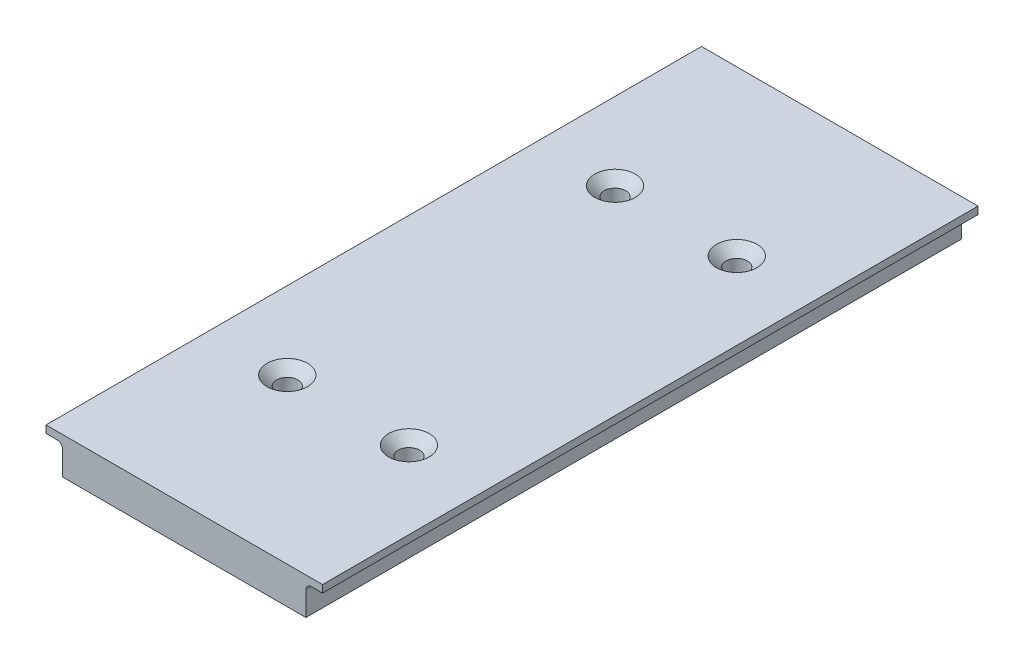
ISO-10303-21;
HEADER;
FILE_DESCRIPTION(('STEP AP214'),'2;1');
FILE_NAME('part.step','',(''),(''),'','','');
FILE_SCHEMA(('AUTOMOTIVE_DESIGN { 1 0 10303 214 1 1 1 1 }'));
ENDSEC;
DATA;
#1=APPLICATION_CONTEXT('core data for automotive mechanical design processes');
#2=APPLICATION_PROTOCOL_DEFINITION('international standard','automotive_design',2000,#1);
#3=PRODUCT_CONTEXT('',#1,'mechanical');
#4=PRODUCT('Part','Part','',(#3));
#5=PRODUCT_RELATED_PRODUCT_CATEGORY('part','',(#4));
#6=PRODUCT_DEFINITION_FORMATION('','',#4);
#7=PRODUCT_DEFINITION_CONTEXT('part definition',#1,'design');
#8=PRODUCT_DEFINITION('design','',#6,#7);
#9=PRODUCT_DEFINITION_SHAPE('','',#8);
#10=(LENGTH_UNIT() NAMED_UNIT(*) SI_UNIT(.MILLI.,.METRE.));
#11=(NAMED_UNIT(*) PLANE_ANGLE_UNIT() SI_UNIT($,.RADIAN.));
#12=(NAMED_UNIT(*) SI_UNIT($,.STERADIAN.) SOLID_ANGLE_UNIT());
#13=UNCERTAINTY_MEASURE_WITH_UNIT(LENGTH_MEASURE(1.E-05),#10,'distance_accuracy_value','');
#14=(GEOMETRIC_REPRESENTATION_CONTEXT(3) GLOBAL_UNCERTAINTY_ASSIGNED_CONTEXT((#13)) GLOBAL_UNIT_ASSIGNED_CONTEXT((#10,
#11,#12)) REPRESENTATION_CONTEXT('',''));
#15=CARTESIAN_POINT('',(0.,0.,0.));
#16=DIRECTION('',(0.,0.,1.));
#17=DIRECTION('',(1.,0.,0.));
#18=AXIS2_PLACEMENT_3D('',#15,#16,#17);
#19=CARTESIAN_POINT('',(-18.75,5.,88.9));
#20=DIRECTION('',(0.,-1.,0.));
#21=DIRECTION('',(0.,0.,-1.));
#22=AXIS2_PLACEMENT_3D('',#19,#20,#21);
#23=PLANE('',#22);
#24=CARTESIAN_POINT('',(8.25063197119054,5.,22.223297507914));
#25=DIRECTION('',(0.,1.,0.));
#26=DIRECTION('',(0.,0.,1.));
#27=AXIS2_PLACEMENT_3D('',#24,#25,#26);
#28=CIRCLE('',#27,2.75);
#29=CARTESIAN_POINT('',(8.25063197119054,5.,24.973297507914));
#30=VERTEX_POINT('',#29);
#31=EDGE_CURVE('E319',#30,#30,#28,.T.);
#32=ORIENTED_EDGE('',*,*,#31,.F.);
#33=EDGE_LOOP('',(#32));
#34=FACE_BOUND('',#33,.T.);
#35=CARTESIAN_POINT('',(-8.25063197119054,5.,22.223297507914));
#36=DIRECTION('',(0.,1.,0.));
#37=DIRECTION('',(0.,0.,1.));
#38=AXIS2_PLACEMENT_3D('',#35,#36,#37);
#39=CIRCLE('',#38,2.75);
#40=CARTESIAN_POINT('',(-8.25063197119054,5.,24.973297507914));
#41=VERTEX_POINT('',#40);
#42=EDGE_CURVE('E307',#41,#41,#39,.T.);
#43=ORIENTED_EDGE('',*,*,#42,.F.);
#44=EDGE_LOOP('',(#43));
#45=FACE_BOUND('',#44,.T.);
#46=CARTESIAN_POINT('',(-8.25063197119054,5.,66.676702492086));
#47=DIRECTION('',(0.,1.,0.));
#48=DIRECTION('',(0.,0.,1.));
#49=AXIS2_PLACEMENT_3D('',#46,#47,#48);
#50=CIRCLE('',#49,2.75);
#51=CARTESIAN_POINT('',(-8.25063197119054,5.,69.426702492086));
#52=VERTEX_POINT('',#51);
#53=EDGE_CURVE('E295',#52,#52,#50,.T.);
#54=ORIENTED_EDGE('',*,*,#53,.F.);
#55=EDGE_LOOP('',(#54));
#56=FACE_BOUND('',#55,.T.);
#57=CARTESIAN_POINT('',(8.25063197119054,5.,66.676702492086));
#58=DIRECTION('',(0.,1.,0.));
#59=DIRECTION('',(0.,0.,1.));
#60=AXIS2_PLACEMENT_3D('',#57,#58,#59);
#61=CIRCLE('',#60,2.75);
#62=CARTESIAN_POINT('',(8.25063197119054,5.,69.426702492086));
#63=VERTEX_POINT('',#62);
#64=EDGE_CURVE('E283',#63,#63,#61,.T.);
#65=ORIENTED_EDGE('',*,*,#64,.F.);
#66=EDGE_LOOP('',(#65));
#67=FACE_BOUND('',#66,.T.);
#68=DIRECTION('',(-1.,0.,0.));
#69=VECTOR('',#68,1.);
#70=CARTESIAN_POINT('',(-18.75,5.,0.));
#71=LINE('',#70,#69);
#72=CARTESIAN_POINT('',(18.75,5.,0.));
#73=VERTEX_POINT('',#72);
#74=CARTESIAN_POINT('',(-18.75,5.,0.));
#75=VERTEX_POINT('',#74);
#76=EDGE_CURVE('E180',#73,#75,#71,.T.);
#77=ORIENTED_EDGE('',*,*,#76,.T.);
#78=DIRECTION('',(0.,0.,-1.));
#79=VECTOR('',#78,1.);
#80=CARTESIAN_POINT('',(-18.75,5.,88.9));
#81=LINE('',#80,#79);
#82=CARTESIAN_POINT('',(-18.75,5.,88.9));
#83=VERTEX_POINT('',#82);
#84=EDGE_CURVE('E11',#83,#75,#81,.T.);
#85=ORIENTED_EDGE('',*,*,#84,.F.);
#86=DIRECTION('',(-1.,0.,0.));
#87=VECTOR('',#86,1.);
#88=CARTESIAN_POINT('',(-18.75,5.,88.9));
#89=LINE('',#88,#87);
#90=CARTESIAN_POINT('',(18.75,5.,88.9));
#91=VERTEX_POINT('',#90);
#92=EDGE_CURVE('E209',#91,#83,#89,.T.);
#93=ORIENTED_EDGE('',*,*,#92,.F.);
#94=DIRECTION('',(0.,0.,-1.));
#95=VECTOR('',#94,1.);
#96=CARTESIAN_POINT('',(18.75,5.,88.9));
#97=LINE('',#96,#95);
#98=EDGE_CURVE('E176',#91,#73,#97,.T.);
#99=ORIENTED_EDGE('',*,*,#98,.T.);
#100=EDGE_LOOP('',(#77,#85,#93,#99));
#101=FACE_BOUND('',#100,.T.);
#102=ADVANCED_FACE('F40',(#34,#45,#56,#67,#101),#23,.F.);
#103=CARTESIAN_POINT('',(-18.75,4.,88.9));
#104=DIRECTION('',(1.,0.,0.));
#105=DIRECTION('',(0.,0.,-1.));
#106=AXIS2_PLACEMENT_3D('',#103,#104,#105);
#107=PLANE('',#106);
#108=DIRECTION('',(0.,-1.,0.));
#109=VECTOR('',#108,1.);
#110=CARTESIAN_POINT('',(-18.75,4.,0.));
#111=LINE('',#110,#109);
#112=CARTESIAN_POINT('',(-18.75,4.,0.));
#113=VERTEX_POINT('',#112);
#114=EDGE_CURVE('E184',#75,#113,#111,.T.);
#115=ORIENTED_EDGE('',*,*,#114,.T.);
#116=DIRECTION('',(0.,0.,-1.));
#117=VECTOR('',#116,1.);
#118=CARTESIAN_POINT('',(-18.75,4.,88.9));
#119=LINE('',#118,#117);
#120=CARTESIAN_POINT('',(-18.75,4.,88.9));
#121=VERTEX_POINT('',#120);
#122=EDGE_CURVE('E49',#121,#113,#119,.T.);
#123=ORIENTED_EDGE('',*,*,#122,.F.);
#124=DIRECTION('',(0.,-1.,0.));
#125=VECTOR('',#124,1.);
#126=CARTESIAN_POINT('',(-18.75,4.,88.9));
#127=LINE('',#126,#125);
#128=EDGE_CURVE('E125',#83,#121,#127,.T.);
#129=ORIENTED_EDGE('',*,*,#128,.F.);
#130=ORIENTED_EDGE('',*,*,#84,.T.);
#131=EDGE_LOOP('',(#115,#123,#129,#130));
#132=FACE_BOUND('',#131,.T.);
#133=ADVANCED_FACE('F328',(#132),#107,.F.);
#134=CARTESIAN_POINT('',(-18.75,4.,88.9));
#135=DIRECTION('',(0.,1.,0.));
#136=DIRECTION('',(0.,0.,1.));
#137=AXIS2_PLACEMENT_3D('',#134,#135,#136);
#138=PLANE('',#137);
#139=DIRECTION('',(1.,0.,0.));
#140=VECTOR('',#139,1.);
#141=CARTESIAN_POINT('',(-18.75,4.,0.));
#142=LINE('',#141,#140);
#143=CARTESIAN_POINT('',(-17.25,4.,0.));
#144=VERTEX_POINT('',#143);
#145=EDGE_CURVE('E188',#113,#144,#142,.T.);
#146=ORIENTED_EDGE('',*,*,#145,.T.);
#147=DIRECTION('',(0.,0.,-1.));
#148=VECTOR('',#147,1.);
#149=CARTESIAN_POINT('',(-17.25,4.,88.9));
#150=LINE('',#149,#148);
#151=CARTESIAN_POINT('',(-17.25,4.,88.9));
#152=VERTEX_POINT('',#151);
#153=EDGE_CURVE('E228',#152,#144,#150,.T.);
#154=ORIENTED_EDGE('',*,*,#153,.F.);
#155=DIRECTION('',(1.,0.,0.));
#156=VECTOR('',#155,1.);
#157=CARTESIAN_POINT('',(-18.75,4.,88.9));
#158=LINE('',#157,#156);
#159=EDGE_CURVE('E239',#121,#152,#158,.T.);
#160=ORIENTED_EDGE('',*,*,#159,.F.);
#161=ORIENTED_EDGE('',*,*,#122,.T.);
#162=EDGE_LOOP('',(#146,#154,#160,#161));
#163=FACE_BOUND('',#162,.T.);
#164=ADVANCED_FACE('F237',(#163),#138,.F.);
#165=CARTESIAN_POINT('',(-17.25,3.25,88.9));
#166=DIRECTION('',(0.,0.,-1.));
#167=DIRECTION('',(-1.,0.,0.));
#168=AXIS2_PLACEMENT_3D('',#165,#166,#167);
#169=CYLINDRICAL_SURFACE('',#168,0.750000000000001);
#170=CARTESIAN_POINT('',(-17.25,3.25,0.));
#171=DIRECTION('',(0.,0.,-1.));
#172=DIRECTION('',(-1.,0.,0.));
#173=AXIS2_PLACEMENT_3D('',#170,#171,#172);
#174=CIRCLE('',#173,0.750000000000001);
#175=CARTESIAN_POINT('',(-16.5,3.25,0.));
#176=VERTEX_POINT('',#175);
#177=EDGE_CURVE('E191',#144,#176,#174,.T.);
#178=ORIENTED_EDGE('',*,*,#177,.T.);
#179=DIRECTION('',(0.,0.,-1.));
#180=VECTOR('',#179,1.);
#181=CARTESIAN_POINT('',(-16.5,3.25,88.9));
#182=LINE('',#181,#180);
#183=CARTESIAN_POINT('',(-16.5,3.25,88.9));
#184=VERTEX_POINT('',#183);
#185=EDGE_CURVE('E224',#184,#176,#182,.T.);
#186=ORIENTED_EDGE('',*,*,#185,.F.);
#187=CARTESIAN_POINT('',(-17.25,3.25,88.9));
#188=DIRECTION('',(0.,0.,-1.));
#189=DIRECTION('',(-1.,0.,0.));
#190=AXIS2_PLACEMENT_3D('',#187,#188,#189);
#191=CIRCLE('',#190,0.750000000000001);
#192=EDGE_CURVE('E258',#152,#184,#191,.T.);
#193=ORIENTED_EDGE('',*,*,#192,.F.);
#194=ORIENTED_EDGE('',*,*,#153,.T.);
#195=EDGE_LOOP('',(#178,#186,#193,#194));
#196=FACE_BOUND('',#195,.T.);
#197=ADVANCED_FACE('F248',(#196),#169,.F.);
#198=CARTESIAN_POINT('',(-16.5,3.25,88.9));
#199=DIRECTION('',(1.,0.,0.));
#200=DIRECTION('',(0.,0.,-1.));
#201=AXIS2_PLACEMENT_3D('',#198,#199,#200);
#202=PLANE('',#201);
#203=DIRECTION('',(0.,-1.,0.));
#204=VECTOR('',#203,1.);
#205=CARTESIAN_POINT('',(-16.5,3.25,0.));
#206=LINE('',#205,#204);
#207=CARTESIAN_POINT('',(-16.5,0.,0.));
#208=VERTEX_POINT('',#207);
#209=EDGE_CURVE('E194',#176,#208,#206,.T.);
#210=ORIENTED_EDGE('',*,*,#209,.T.);
#211=DIRECTION('',(0.,0.,-1.));
#212=VECTOR('',#211,1.);
#213=CARTESIAN_POINT('',(-16.5,0.,88.9));
#214=LINE('',#213,#212);
#215=CARTESIAN_POINT('',(-16.5,0.,88.9));
#216=VERTEX_POINT('',#215);
#217=EDGE_CURVE('E220',#216,#208,#214,.T.);
#218=ORIENTED_EDGE('',*,*,#217,.F.);
#219=DIRECTION('',(0.,-1.,0.));
#220=VECTOR('',#219,1.);
#221=CARTESIAN_POINT('',(-16.5,3.25,88.9));
#222=LINE('',#221,#220);
#223=EDGE_CURVE('E254',#184,#216,#222,.T.);
#224=ORIENTED_EDGE('',*,*,#223,.F.);
#225=ORIENTED_EDGE('',*,*,#185,.T.);
#226=EDGE_LOOP('',(#210,#218,#224,#225));
#227=FACE_BOUND('',#226,.T.);
#228=ADVANCED_FACE('F252',(#227),#202,.F.);
#229=CARTESIAN_POINT('',(-16.5,0.,88.9));
#230=DIRECTION('',(0.,1.,0.));
#231=DIRECTION('',(0.,0.,1.));
#232=AXIS2_PLACEMENT_3D('',#229,#230,#231);
#233=PLANE('',#232);
#234=CARTESIAN_POINT('',(8.25063197119054,0.,22.223297507914));
#235=DIRECTION('',(0.,1.,0.));
#236=DIRECTION('',(0.,0.,1.));
#237=AXIS2_PLACEMENT_3D('',#234,#235,#236);
#238=CIRCLE('',#237,1.44999999999999);
#239=CARTESIAN_POINT('',(8.25063197119054,0.,23.673297507914));
#240=VERTEX_POINT('',#239);
#241=EDGE_CURVE('E311',#240,#240,#238,.T.);
#242=ORIENTED_EDGE('',*,*,#241,.T.);
#243=EDGE_LOOP('',(#242));
#244=FACE_BOUND('',#243,.T.);
#245=CARTESIAN_POINT('',(-8.25063197119054,0.,22.223297507914));
#246=DIRECTION('',(0.,1.,0.));
#247=DIRECTION('',(0.,0.,1.));
#248=AXIS2_PLACEMENT_3D('',#245,#246,#247);
#249=CIRCLE('',#248,1.44999999999999);
#250=CARTESIAN_POINT('',(-8.25063197119054,0.,23.673297507914));
#251=VERTEX_POINT('',#250);
#252=EDGE_CURVE('E299',#251,#251,#249,.T.);
#253=ORIENTED_EDGE('',*,*,#252,.T.);
#254=EDGE_LOOP('',(#253));
#255=FACE_BOUND('',#254,.T.);
#256=CARTESIAN_POINT('',(-8.25063197119054,0.,66.676702492086));
#257=DIRECTION('',(0.,1.,0.));
#258=DIRECTION('',(0.,0.,1.));
#259=AXIS2_PLACEMENT_3D('',#256,#257,#258);
#260=CIRCLE('',#259,1.44999999999999);
#261=CARTESIAN_POINT('',(-8.25063197119054,0.,68.126702492086));
#262=VERTEX_POINT('',#261);
#263=EDGE_CURVE('E287',#262,#262,#260,.T.);
#264=ORIENTED_EDGE('',*,*,#263,.T.);
#265=EDGE_LOOP('',(#264));
#266=FACE_BOUND('',#265,.T.);
#267=CARTESIAN_POINT('',(8.25063197119054,0.,66.676702492086));
#268=DIRECTION('',(0.,1.,0.));
#269=DIRECTION('',(0.,0.,1.));
#270=AXIS2_PLACEMENT_3D('',#267,#268,#269);
#271=CIRCLE('',#270,1.44999999999999);
#272=CARTESIAN_POINT('',(8.25063197119054,0.,68.126702492086));
#273=VERTEX_POINT('',#272);
#274=EDGE_CURVE('E185',#273,#273,#271,.T.);
#275=ORIENTED_EDGE('',*,*,#274,.T.);
#276=EDGE_LOOP('',(#275));
#277=FACE_BOUND('',#276,.T.);
#278=DIRECTION('',(1.,0.,0.));
#279=VECTOR('',#278,1.);
#280=CARTESIAN_POINT('',(-16.5,0.,0.));
#281=LINE('',#280,#279);
#282=CARTESIAN_POINT('',(16.5,0.,0.));
#283=VERTEX_POINT('',#282);
#284=EDGE_CURVE('E197',#208,#283,#281,.T.);
#285=ORIENTED_EDGE('',*,*,#284,.T.);
#286=DIRECTION('',(0.,0.,-1.));
#287=VECTOR('',#286,1.);
#288=CARTESIAN_POINT('',(16.5,0.,88.9));
#289=LINE('',#288,#287);
#290=CARTESIAN_POINT('',(16.5,0.,88.9));
#291=VERTEX_POINT('',#290);
#292=EDGE_CURVE('E216',#291,#283,#289,.T.);
#293=ORIENTED_EDGE('',*,*,#292,.F.);
#294=DIRECTION('',(1.,0.,0.));
#295=VECTOR('',#294,1.);
#296=CARTESIAN_POINT('',(-16.5,0.,88.9));
#297=LINE('',#296,#295);
#298=EDGE_CURVE('E257',#216,#291,#297,.T.);
#299=ORIENTED_EDGE('',*,*,#298,.F.);
#300=ORIENTED_EDGE('',*,*,#217,.T.);
#301=EDGE_LOOP('',(#285,#293,#299,#300));
#302=FACE_BOUND('',#301,.T.);
#303=ADVANCED_FACE('F342',(#244,#255,#266,#277,#302),#233,.F.);
#304=CARTESIAN_POINT('',(16.5,3.25,88.9));
#305=DIRECTION('',(-1.,0.,0.));
#306=DIRECTION('',(0.,0.,1.));
#307=AXIS2_PLACEMENT_3D('',#304,#305,#306);
#308=PLANE('',#307);
#309=DIRECTION('',(0.,1.,0.));
#310=VECTOR('',#309,1.);
#311=CARTESIAN_POINT('',(16.5,3.25,0.));
#312=LINE('',#311,#310);
#313=CARTESIAN_POINT('',(16.5,3.25,0.));
#314=VERTEX_POINT('',#313);
#315=EDGE_CURVE('E200',#283,#314,#312,.T.);
#316=ORIENTED_EDGE('',*,*,#315,.T.);
#317=DIRECTION('',(0.,0.,-1.));
#318=VECTOR('',#317,1.);
#319=CARTESIAN_POINT('',(16.5,3.25,88.9));
#320=LINE('',#319,#318);
#321=CARTESIAN_POINT('',(16.5,3.25,88.9));
#322=VERTEX_POINT('',#321);
#323=EDGE_CURVE('E168',#322,#314,#320,.T.);
#324=ORIENTED_EDGE('',*,*,#323,.F.);
#325=DIRECTION('',(0.,1.,0.));
#326=VECTOR('',#325,1.);
#327=CARTESIAN_POINT('',(16.5,3.25,88.9));
#328=LINE('',#327,#326);
#329=EDGE_CURVE('E157',#291,#322,#328,.T.);
#330=ORIENTED_EDGE('',*,*,#329,.F.);
#331=ORIENTED_EDGE('',*,*,#292,.T.);
#332=EDGE_LOOP('',(#316,#324,#330,#331));
#333=FACE_BOUND('',#332,.T.);
#334=ADVANCED_FACE('F339',(#333),#308,.F.);
#335=CARTESIAN_POINT('',(17.25,3.25,88.9));
#336=DIRECTION('',(0.,0.,-1.));
#337=DIRECTION('',(-1.,0.,0.));
#338=AXIS2_PLACEMENT_3D('',#335,#336,#337);
#339=CYLINDRICAL_SURFACE('',#338,0.750000000000001);
#340=CARTESIAN_POINT('',(17.25,3.25,0.));
#341=DIRECTION('',(0.,0.,-1.));
#342=DIRECTION('',(1.,0.,0.));
#343=AXIS2_PLACEMENT_3D('',#340,#341,#342);
#344=CIRCLE('',#343,0.750000000000001);
#345=CARTESIAN_POINT('',(17.25,4.,0.));
#346=VERTEX_POINT('',#345);
#347=EDGE_CURVE('E166',#314,#346,#344,.T.);
#348=ORIENTED_EDGE('',*,*,#347,.T.);
#349=DIRECTION('',(0.,0.,-1.));
#350=VECTOR('',#349,1.);
#351=CARTESIAN_POINT('',(17.25,4.,88.9));
#352=LINE('',#351,#350);
#353=CARTESIAN_POINT('',(17.25,4.,88.9));
#354=VERTEX_POINT('',#353);
#355=EDGE_CURVE('E163',#354,#346,#352,.T.);
#356=ORIENTED_EDGE('',*,*,#355,.F.);
#357=CARTESIAN_POINT('',(17.25,3.25,88.9));
#358=DIRECTION('',(0.,0.,-1.));
#359=DIRECTION('',(1.,0.,0.));
#360=AXIS2_PLACEMENT_3D('',#357,#358,#359);
#361=CIRCLE('',#360,0.750000000000001);
#362=EDGE_CURVE('E151',#322,#354,#361,.T.);
#363=ORIENTED_EDGE('',*,*,#362,.F.);
#364=ORIENTED_EDGE('',*,*,#323,.T.);
#365=EDGE_LOOP('',(#348,#356,#363,#364));
#366=FACE_BOUND('',#365,.T.);
#367=ADVANCED_FACE('F164',(#366),#339,.F.);
#368=CARTESIAN_POINT('',(18.75,4.,88.9));
#369=DIRECTION('',(0.,1.,0.));
#370=DIRECTION('',(0.,0.,1.));
#371=AXIS2_PLACEMENT_3D('',#368,#369,#370);
#372=PLANE('',#371);
#373=DIRECTION('',(1.,0.,0.));
#374=VECTOR('',#373,1.);
#375=CARTESIAN_POINT('',(18.75,4.,0.));
#376=LINE('',#375,#374);
#377=CARTESIAN_POINT('',(18.75,4.,0.));
#378=VERTEX_POINT('',#377);
#379=EDGE_CURVE('E107',#346,#378,#376,.T.);
#380=ORIENTED_EDGE('',*,*,#379,.T.);
#381=DIRECTION('',(0.,0.,-1.));
#382=VECTOR('',#381,1.);
#383=CARTESIAN_POINT('',(18.75,4.,88.9));
#384=LINE('',#383,#382);
#385=CARTESIAN_POINT('',(18.75,4.,88.9));
#386=VERTEX_POINT('',#385);
#387=EDGE_CURVE('E169',#386,#378,#384,.T.);
#388=ORIENTED_EDGE('',*,*,#387,.F.);
#389=DIRECTION('',(1.,0.,0.));
#390=VECTOR('',#389,1.);
#391=CARTESIAN_POINT('',(18.75,4.,88.9));
#392=LINE('',#391,#390);
#393=EDGE_CURVE('E155',#354,#386,#392,.T.);
#394=ORIENTED_EDGE('',*,*,#393,.F.);
#395=ORIENTED_EDGE('',*,*,#355,.T.);
#396=EDGE_LOOP('',(#380,#388,#394,#395));
#397=FACE_BOUND('',#396,.T.);
#398=ADVANCED_FACE('F171',(#397),#372,.F.);
#399=CARTESIAN_POINT('',(18.75,4.,88.9));
#400=DIRECTION('',(-1.,0.,0.));
#401=DIRECTION('',(0.,0.,1.));
#402=AXIS2_PLACEMENT_3D('',#399,#400,#401);
#403=PLANE('',#402);
#404=DIRECTION('',(0.,1.,0.));
#405=VECTOR('',#404,1.);
#406=CARTESIAN_POINT('',(18.75,4.,0.));
#407=LINE('',#406,#405);
#408=EDGE_CURVE('E115',#378,#73,#407,.T.);
#409=ORIENTED_EDGE('',*,*,#408,.T.);
#410=ORIENTED_EDGE('',*,*,#98,.F.);
#411=DIRECTION('',(0.,1.,0.));
#412=VECTOR('',#411,1.);
#413=CARTESIAN_POINT('',(18.75,4.,88.9));
#414=LINE('',#413,#412);
#415=EDGE_CURVE('E61',#386,#91,#414,.T.);
#416=ORIENTED_EDGE('',*,*,#415,.F.);
#417=ORIENTED_EDGE('',*,*,#387,.T.);
#418=EDGE_LOOP('',(#409,#410,#416,#417));
#419=FACE_BOUND('',#418,.T.);
#420=ADVANCED_FACE('F402',(#419),#403,.F.);
#421=CARTESIAN_POINT('',(17.25,3.25,88.9));
#422=DIRECTION('',(0.,0.,1.));
#423=DIRECTION('',(1.,0.,0.));
#424=AXIS2_PLACEMENT_3D('',#421,#422,#423);
#425=PLANE('',#424);
#426=ORIENTED_EDGE('',*,*,#92,.T.);
#427=ORIENTED_EDGE('',*,*,#128,.T.);
#428=ORIENTED_EDGE('',*,*,#159,.T.);
#429=ORIENTED_EDGE('',*,*,#192,.T.);
#430=ORIENTED_EDGE('',*,*,#223,.T.);
#431=ORIENTED_EDGE('',*,*,#298,.T.);
#432=ORIENTED_EDGE('',*,*,#329,.T.);
#433=ORIENTED_EDGE('',*,*,#362,.T.);
#434=ORIENTED_EDGE('',*,*,#393,.T.);
#435=ORIENTED_EDGE('',*,*,#415,.T.);
#436=EDGE_LOOP('',(#426,#427,#428,#429,#430,#431,#432,#433,#434,#435));
#437=FACE_BOUND('',#436,.T.);
#438=ADVANCED_FACE('F153',(#437),#425,.T.);
#439=CARTESIAN_POINT('',(17.25,3.25,0.));
#440=DIRECTION('',(0.,0.,1.));
#441=DIRECTION('',(1.,0.,0.));
#442=AXIS2_PLACEMENT_3D('',#439,#440,#441);
#443=PLANE('',#442);
#444=ORIENTED_EDGE('',*,*,#76,.F.);
#445=ORIENTED_EDGE('',*,*,#408,.F.);
#446=ORIENTED_EDGE('',*,*,#379,.F.);
#447=ORIENTED_EDGE('',*,*,#347,.F.);
#448=ORIENTED_EDGE('',*,*,#315,.F.);
#449=ORIENTED_EDGE('',*,*,#284,.F.);
#450=ORIENTED_EDGE('',*,*,#209,.F.);
#451=ORIENTED_EDGE('',*,*,#177,.F.);
#452=ORIENTED_EDGE('',*,*,#145,.F.);
#453=ORIENTED_EDGE('',*,*,#114,.F.);
#454=EDGE_LOOP('',(#444,#445,#446,#447,#448,#449,#450,#451,#452,#453));
#455=FACE_BOUND('',#454,.T.);
#456=ADVANCED_FACE('F243',(#455),#443,.F.);
#457=CARTESIAN_POINT('',(8.25063197119054,5.,66.676702492086));
#458=DIRECTION('',(0.,1.,0.));
#459=DIRECTION('',(0.,0.,1.));
#460=AXIS2_PLACEMENT_3D('',#457,#458,#459);
#461=CYLINDRICAL_SURFACE('',#460,1.44999999999999);
#462=ORIENTED_EDGE('',*,*,#274,.F.);
#463=EDGE_LOOP('',(#462));
#464=FACE_BOUND('',#463,.T.);
#465=CARTESIAN_POINT('',(8.25063197119054,3.7,66.676702492086));
#466=DIRECTION('',(0.,1.,0.));
#467=DIRECTION('',(0.,0.,1.));
#468=AXIS2_PLACEMENT_3D('',#465,#466,#467);
#469=CIRCLE('',#468,1.45);
#470=CARTESIAN_POINT('',(8.25063197119054,3.7,68.126702492086));
#471=VERTEX_POINT('',#470);
#472=EDGE_CURVE('E279',#471,#471,#469,.T.);
#473=ORIENTED_EDGE('',*,*,#472,.T.);
#474=EDGE_LOOP('',(#473));
#475=FACE_BOUND('',#474,.T.);
#476=ADVANCED_FACE('F427',(#464,#475),#461,.F.);
#477=CARTESIAN_POINT('',(8.25063197119054,5.,66.676702492086));
#478=DIRECTION('',(0.,1.,0.));
#479=DIRECTION('',(0.,0.,1.));
#480=AXIS2_PLACEMENT_3D('',#477,#478,#479);
#481=CONICAL_SURFACE('',#480,2.75,0.785398163397447);
#482=ORIENTED_EDGE('',*,*,#472,.F.);
#483=EDGE_LOOP('',(#482));
#484=FACE_BOUND('',#483,.T.);
#485=ORIENTED_EDGE('',*,*,#64,.T.);
#486=EDGE_LOOP('',(#485));
#487=FACE_BOUND('',#486,.T.);
#488=ADVANCED_FACE('F435',(#484,#487),#481,.F.);
#489=CARTESIAN_POINT('',(-8.25063197119054,5.,66.676702492086));
#490=DIRECTION('',(0.,1.,0.));
#491=DIRECTION('',(0.,0.,1.));
#492=AXIS2_PLACEMENT_3D('',#489,#490,#491);
#493=CYLINDRICAL_SURFACE('',#492,1.44999999999999);
#494=ORIENTED_EDGE('',*,*,#263,.F.);
#495=EDGE_LOOP('',(#494));
#496=FACE_BOUND('',#495,.T.);
#497=CARTESIAN_POINT('',(-8.25063197119054,3.7,66.676702492086));
#498=DIRECTION('',(0.,1.,0.));
#499=DIRECTION('',(0.,0.,1.));
#500=AXIS2_PLACEMENT_3D('',#497,#498,#499);
#501=CIRCLE('',#500,1.45);
#502=CARTESIAN_POINT('',(-8.25063197119054,3.7,68.126702492086));
#503=VERTEX_POINT('',#502);
#504=EDGE_CURVE('E291',#503,#503,#501,.T.);
#505=ORIENTED_EDGE('',*,*,#504,.T.);
#506=EDGE_LOOP('',(#505));
#507=FACE_BOUND('',#506,.T.);
#508=ADVANCED_FACE('F445',(#496,#507),#493,.F.);
#509=CARTESIAN_POINT('',(-8.25063197119054,5.,66.676702492086));
#510=DIRECTION('',(0.,1.,0.));
#511=DIRECTION('',(0.,0.,1.));
#512=AXIS2_PLACEMENT_3D('',#509,#510,#511);
#513=CONICAL_SURFACE('',#512,2.75,0.785398163397447);
#514=ORIENTED_EDGE('',*,*,#504,.F.);
#515=EDGE_LOOP('',(#514));
#516=FACE_BOUND('',#515,.T.);
#517=ORIENTED_EDGE('',*,*,#53,.T.);
#518=EDGE_LOOP('',(#517));
#519=FACE_BOUND('',#518,.T.);
#520=ADVANCED_FACE('F455',(#516,#519),#513,.F.);
#521=CARTESIAN_POINT('',(-8.25063197119054,5.,22.223297507914));
#522=DIRECTION('',(0.,1.,0.));
#523=DIRECTION('',(0.,0.,1.));
#524=AXIS2_PLACEMENT_3D('',#521,#522,#523);
#525=CYLINDRICAL_SURFACE('',#524,1.44999999999999);
#526=ORIENTED_EDGE('',*,*,#252,.F.);
#527=EDGE_LOOP('',(#526));
#528=FACE_BOUND('',#527,.T.);
#529=CARTESIAN_POINT('',(-8.25063197119054,3.7,22.223297507914));
#530=DIRECTION('',(0.,1.,0.));
#531=DIRECTION('',(0.,0.,1.));
#532=AXIS2_PLACEMENT_3D('',#529,#530,#531);
#533=CIRCLE('',#532,1.45);
#534=CARTESIAN_POINT('',(-8.25063197119054,3.7,23.673297507914));
#535=VERTEX_POINT('',#534);
#536=EDGE_CURVE('E303',#535,#535,#533,.T.);
#537=ORIENTED_EDGE('',*,*,#536,.T.);
#538=EDGE_LOOP('',(#537));
#539=FACE_BOUND('',#538,.T.);
#540=ADVANCED_FACE('F465',(#528,#539),#525,.F.);
#541=CARTESIAN_POINT('',(-8.25063197119054,5.,22.223297507914));
#542=DIRECTION('',(0.,1.,0.));
#543=DIRECTION('',(0.,0.,1.));
#544=AXIS2_PLACEMENT_3D('',#541,#542,#543);
#545=CONICAL_SURFACE('',#544,2.75,0.785398163397447);
#546=ORIENTED_EDGE('',*,*,#536,.F.);
#547=EDGE_LOOP('',(#546));
#548=FACE_BOUND('',#547,.T.);
#549=ORIENTED_EDGE('',*,*,#42,.T.);
#550=EDGE_LOOP('',(#549));
#551=FACE_BOUND('',#550,.T.);
#552=ADVANCED_FACE('F475',(#548,#551),#545,.F.);
#553=CARTESIAN_POINT('',(8.25063197119054,5.,22.223297507914));
#554=DIRECTION('',(0.,1.,0.));
#555=DIRECTION('',(0.,0.,1.));
#556=AXIS2_PLACEMENT_3D('',#553,#554,#555);
#557=CYLINDRICAL_SURFACE('',#556,1.44999999999999);
#558=ORIENTED_EDGE('',*,*,#241,.F.);
#559=EDGE_LOOP('',(#558));
#560=FACE_BOUND('',#559,.T.);
#561=CARTESIAN_POINT('',(8.25063197119054,3.7,22.223297507914));
#562=DIRECTION('',(0.,1.,0.));
#563=DIRECTION('',(0.,0.,1.));
#564=AXIS2_PLACEMENT_3D('',#561,#562,#563);
#565=CIRCLE('',#564,1.45);
#566=CARTESIAN_POINT('',(8.25063197119054,3.7,23.673297507914));
#567=VERTEX_POINT('',#566);
#568=EDGE_CURVE('E315',#567,#567,#565,.T.);
#569=ORIENTED_EDGE('',*,*,#568,.T.);
#570=EDGE_LOOP('',(#569));
#571=FACE_BOUND('',#570,.T.);
#572=ADVANCED_FACE('F485',(#560,#571),#557,.F.);
#573=CARTESIAN_POINT('',(8.25063197119054,5.,22.223297507914));
#574=DIRECTION('',(0.,1.,0.));
#575=DIRECTION('',(0.,0.,1.));
#576=AXIS2_PLACEMENT_3D('',#573,#574,#575);
#577=CONICAL_SURFACE('',#576,2.75,0.785398163397447);
#578=ORIENTED_EDGE('',*,*,#568,.F.);
#579=EDGE_LOOP('',(#578));
#580=FACE_BOUND('',#579,.T.);
#581=ORIENTED_EDGE('',*,*,#31,.T.);
#582=EDGE_LOOP('',(#581));
#583=FACE_BOUND('',#582,.T.);
#584=ADVANCED_FACE('F324',(#580,#583),#577,.F.);
#585=CLOSED_SHELL('',(#102,#133,#164,#197,#228,#303,#334,#367,#398,#420,#438,#456,#476,#488,
#508,#520,#540,#552,#572,#584));
#586=MANIFOLD_SOLID_BREP('B2',#585);
#587=ADVANCED_BREP_SHAPE_REPRESENTATION('',(#18,#586),#14);
#588=SHAPE_DEFINITION_REPRESENTATION(#9,#587);
ENDSEC;
END-ISO-10303-21;
